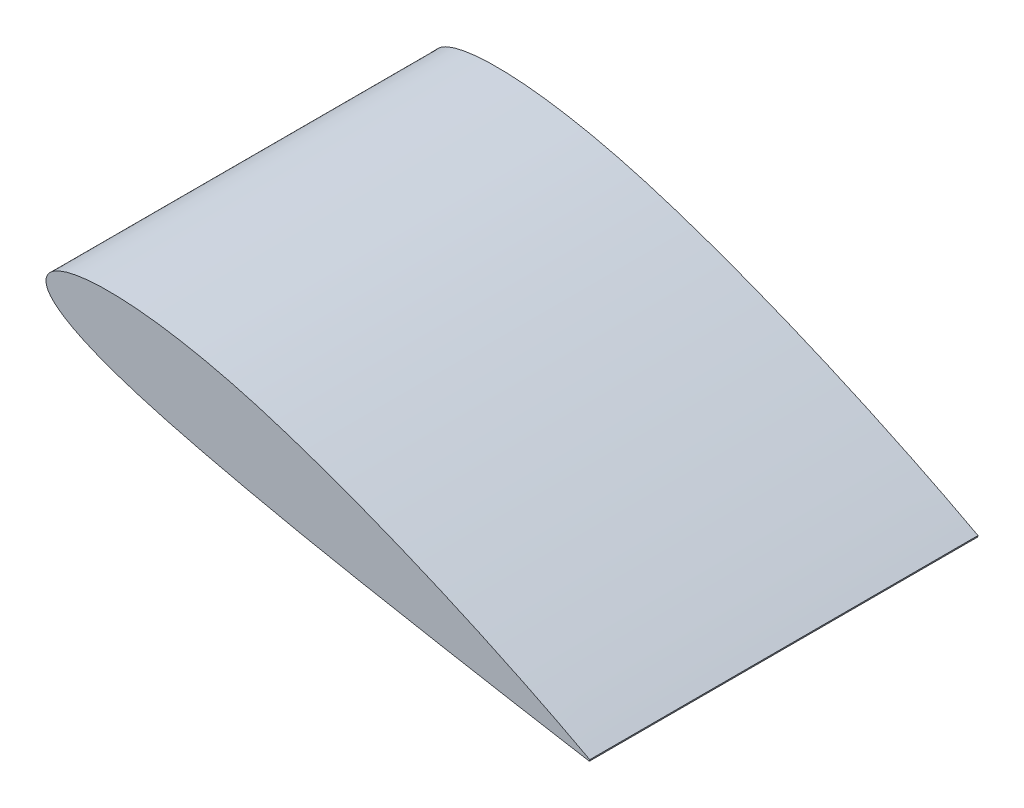
ISO-10303-21;
HEADER;
FILE_DESCRIPTION(('STEP AP214'),'2;1');
FILE_NAME('part.step','',(''),(''),'','','');
FILE_SCHEMA(('AUTOMOTIVE_DESIGN { 1 0 10303 214 1 1 1 1 }'));
ENDSEC;
DATA;
#1=APPLICATION_CONTEXT('core data for automotive mechanical design processes');
#2=APPLICATION_PROTOCOL_DEFINITION('international standard','automotive_design',2000,#1);
#3=PRODUCT_CONTEXT('',#1,'mechanical');
#4=PRODUCT('Part','Part','',(#3));
#5=PRODUCT_RELATED_PRODUCT_CATEGORY('part','',(#4));
#6=PRODUCT_DEFINITION_FORMATION('','',#4);
#7=PRODUCT_DEFINITION_CONTEXT('part definition',#1,'design');
#8=PRODUCT_DEFINITION('design','',#6,#7);
#9=PRODUCT_DEFINITION_SHAPE('','',#8);
#10=(LENGTH_UNIT() NAMED_UNIT(*) SI_UNIT(.MILLI.,.METRE.));
#11=(NAMED_UNIT(*) PLANE_ANGLE_UNIT() SI_UNIT($,.RADIAN.));
#12=(NAMED_UNIT(*) SI_UNIT($,.STERADIAN.) SOLID_ANGLE_UNIT());
#13=UNCERTAINTY_MEASURE_WITH_UNIT(LENGTH_MEASURE(1.E-05),#10,'distance_accuracy_value','');
#14=(GEOMETRIC_REPRESENTATION_CONTEXT(3) GLOBAL_UNCERTAINTY_ASSIGNED_CONTEXT((#13)) GLOBAL_UNIT_ASSIGNED_CONTEXT((#10,
#11,#12)) REPRESENTATION_CONTEXT('',''));
#15=CARTESIAN_POINT('',(0.,0.,0.));
#16=DIRECTION('',(0.,0.,1.));
#17=DIRECTION('',(1.,0.,0.));
#18=AXIS2_PLACEMENT_3D('',#15,#16,#17);
#19=CARTESIAN_POINT('',(699.902915977155,-187.926757207641,500.));
#20=CARTESIAN_POINT('',(699.333794343994,-187.615798784839,500.));
#21=CARTESIAN_POINT('',(697.003057499241,-186.342323641773,500.));
#22=CARTESIAN_POINT('',(691.706465498897,-183.566720524215,500.));
#23=CARTESIAN_POINT('',(682.929518690761,-178.927202269035,500.));
#24=CARTESIAN_POINT('',(670.734635910661,-172.587268294808,500.));
#25=CARTESIAN_POINT('',(655.254514275697,-164.637979221625,500.));
#26=CARTESIAN_POINT('',(628.51923701653,-151.188127115423,500.));
#27=CARTESIAN_POINT('',(588.238285800469,-131.604730884752,500.));
#28=CARTESIAN_POINT('',(532.717659995749,-105.9918947151,500.));
#29=CARTESIAN_POINT('',(480.985396172177,-83.6049617111104,500.));
#30=CARTESIAN_POINT('',(436.271200745496,-65.3508165835526,500.));
#31=CARTESIAN_POINT('',(401.149264546269,-51.6180728873574,500.));
#32=CARTESIAN_POINT('',(365.418441055391,-38.3681084111872,500.));
#33=CARTESIAN_POINT('',(329.460475280361,-25.7882910033477,500.));
#34=CARTESIAN_POINT('',(293.552968993975,-14.05249294356,500.));
#35=CARTESIAN_POINT('',(258.025883019635,-3.55066883619914,500.));
#36=CARTESIAN_POINT('',(223.256407785801,5.43753248814113,500.));
#37=CARTESIAN_POINT('',(189.768196489828,12.7935484295022,500.));
#38=CARTESIAN_POINT('',(157.957614771441,18.4363564134927,500.));
#39=CARTESIAN_POINT('',(128.211696152898,22.3635813012742,500.));
#40=CARTESIAN_POINT('',(100.886653180819,24.5534931399405,500.));
#41=CARTESIAN_POINT('',(76.3193689961319,25.1099895590709,500.));
#42=CARTESIAN_POINT('',(54.8020067588682,24.1004728455233,500.));
#43=CARTESIAN_POINT('',(36.5732126995239,21.6738742830355,500.));
#44=CARTESIAN_POINT('',(21.7891237429012,17.9428472797509,500.));
#45=CARTESIAN_POINT('',(10.5314709430366,12.9956718416433,500.));
#46=CARTESIAN_POINT('',(2.71012393249206,6.71116474572603,500.));
#47=CARTESIAN_POINT('',(-1.05404577080004,-1.28850777460424,500.));
#48=CARTESIAN_POINT('',(-0.0411436154458281,-10.0547716300213,500.));
#49=CARTESIAN_POINT('',(5.27363422796768,-18.5019472531819,500.));
#50=CARTESIAN_POINT('',(14.1664009090334,-26.8185975559487,500.));
#51=CARTESIAN_POINT('',(26.5991587934725,-35.2436916261235,500.));
#52=CARTESIAN_POINT('',(42.5030034244498,-43.7396667508398,500.));
#53=CARTESIAN_POINT('',(61.7352293342016,-52.24818608363,500.));
#54=CARTESIAN_POINT('',(84.0855758224502,-60.7228727461613,500.));
#55=CARTESIAN_POINT('',(109.321844712911,-69.1001199287331,500.));
#56=CARTESIAN_POINT('',(137.166605657293,-77.3557351475177,500.));
#57=CARTESIAN_POINT('',(167.316492874106,-85.4956608256443,500.));
#58=CARTESIAN_POINT('',(199.448997481871,-93.5080224639628,500.));
#59=CARTESIAN_POINT('',(233.212008302088,-101.433824974304,500.));
#60=CARTESIAN_POINT('',(268.342246073246,-109.334179404314,500.));
#61=CARTESIAN_POINT('',(304.472681481,-117.17291109456,500.));
#62=CARTESIAN_POINT('',(341.252306909443,-124.725547977128,500.));
#63=CARTESIAN_POINT('',(378.150259820163,-132.008668482711,500.));
#64=CARTESIAN_POINT('',(426.343219840961,-141.275278260427,500.));
#65=CARTESIAN_POINT('',(483.808360161579,-151.937469492319,500.));
#66=CARTESIAN_POINT('',(538.779300070836,-161.918440967627,500.));
#67=CARTESIAN_POINT('',(586.903551236403,-170.503937686413,500.));
#68=CARTESIAN_POINT('',(620.2772830802,-176.40528966579,500.));
#69=CARTESIAN_POINT('',(649.654019661737,-181.496335843397,500.));
#70=CARTESIAN_POINT('',(666.762364969982,-184.450528708374,500.));
#71=CARTESIAN_POINT('',(680.287724080427,-186.753782534746,500.));
#72=CARTESIAN_POINT('',(690.062017240682,-188.419767077199,500.));
#73=CARTESIAN_POINT('',(696.003010612765,-189.402300451271,500.));
#74=CARTESIAN_POINT('',(698.665758079207,-189.86531114147,500.));
#75=CARTESIAN_POINT('',(699.351530356892,-189.984556357027,500.));
#76=B_SPLINE_CURVE_WITH_KNOTS('',3,(#19,#20,#21,#22,#23,#24,#25,#26,#27,#28,#29,#30,#31,#32,#33,
#34,#35,#36,#37,#38,#39,#40,#41,#42,#43,#44,#45,#46,#47,#48,#49,#50,#51,#52,#53,#54,#55,#56,#57,
#58,#59,#60,#61,#62,#63,#64,#65,#66,#67,#68,#69,#70,#71,#72,#73,#74,#75),.UNSPECIFIED.,.F.,.F.,
(4,1,1,1,1,1,1,1,1,1,1,1,1,1,1,1,1,1,1,1,1,1,1,1,1,1,1,1,1,1,1,1,1,1,1,1,1,1,1,1,1,1,1,1,1,1,1,
1,1,1,1,1,1,1,4),(0.,0.00130837081542839,0.00535820093360155,0.0120634085253878,
0.0213373007121304,0.0330866187411575,0.0471706431167192,0.0817143521603722,0.123442225424641,
0.170516869891991,0.195424313078073,0.220875125128334,0.246594093158621,0.27230183119837,
0.297725323194622,0.322799376279139,0.347028843152348,0.370161526826169,0.391953614266856,
0.412187725503294,0.430670139078719,0.447230521373444,0.461731544762895,0.474085211958424,
0.484275746782023,0.492391838666874,0.498749378071359,0.504100298021388,0.509453028247956,
0.515789796667128,0.523837665507612,0.533884867180463,0.546005346930758,0.560170801963068,
0.576284399119538,0.59421119075826,0.613803378609794,0.63486930365632,0.657209967038878,
0.680611018884909,0.704834651870993,0.729852897081449,0.755196950720251,0.780582678334603,
0.80572855379656,0.854204496729438,0.898493682913272,0.918442716247676,0.952825660165467,
0.966867903961449,0.97859219917356,0.987851654270917,0.994547443989921,0.998595731738975,1.),.UNSPECIFIED.);
#77=DIRECTION('',(0.,0.,-1.));
#78=VECTOR('',#77,1.);
#79=SURFACE_OF_LINEAR_EXTRUSION('',#76,#78);
#80=CARTESIAN_POINT('',(699.902915977155,-187.926757207641,0.));
#81=CARTESIAN_POINT('',(699.333794343994,-187.615798784839,0.));
#82=CARTESIAN_POINT('',(697.003057499241,-186.342323641773,0.));
#83=CARTESIAN_POINT('',(691.706465498897,-183.566720524215,0.));
#84=CARTESIAN_POINT('',(682.929518690761,-178.927202269035,0.));
#85=CARTESIAN_POINT('',(670.734635910661,-172.587268294808,0.));
#86=CARTESIAN_POINT('',(655.254514275697,-164.637979221625,0.));
#87=CARTESIAN_POINT('',(628.51923701653,-151.188127115423,0.));
#88=CARTESIAN_POINT('',(588.238285800469,-131.604730884752,0.));
#89=CARTESIAN_POINT('',(532.717659995749,-105.9918947151,0.));
#90=CARTESIAN_POINT('',(480.985396172177,-83.6049617111104,0.));
#91=CARTESIAN_POINT('',(436.271200745496,-65.3508165835526,0.));
#92=CARTESIAN_POINT('',(401.149264546269,-51.6180728873574,0.));
#93=CARTESIAN_POINT('',(365.418441055391,-38.3681084111872,0.));
#94=CARTESIAN_POINT('',(329.460475280361,-25.7882910033477,0.));
#95=CARTESIAN_POINT('',(293.552968993975,-14.05249294356,0.));
#96=CARTESIAN_POINT('',(258.025883019635,-3.55066883619914,0.));
#97=CARTESIAN_POINT('',(223.256407785801,5.43753248814113,0.));
#98=CARTESIAN_POINT('',(189.768196489828,12.7935484295022,0.));
#99=CARTESIAN_POINT('',(157.957614771441,18.4363564134927,0.));
#100=CARTESIAN_POINT('',(128.211696152898,22.3635813012742,0.));
#101=CARTESIAN_POINT('',(100.886653180819,24.5534931399405,0.));
#102=CARTESIAN_POINT('',(76.3193689961319,25.1099895590709,0.));
#103=CARTESIAN_POINT('',(54.8020067588682,24.1004728455233,0.));
#104=CARTESIAN_POINT('',(36.5732126995239,21.6738742830355,0.));
#105=CARTESIAN_POINT('',(21.7891237429012,17.9428472797509,0.));
#106=CARTESIAN_POINT('',(10.5314709430366,12.9956718416433,0.));
#107=CARTESIAN_POINT('',(2.71012393249206,6.71116474572603,0.));
#108=CARTESIAN_POINT('',(-1.05404577080004,-1.28850777460424,0.));
#109=CARTESIAN_POINT('',(-0.0411436154458281,-10.0547716300213,0.));
#110=CARTESIAN_POINT('',(5.27363422796768,-18.5019472531819,0.));
#111=CARTESIAN_POINT('',(14.1664009090334,-26.8185975559487,0.));
#112=CARTESIAN_POINT('',(26.5991587934725,-35.2436916261235,0.));
#113=CARTESIAN_POINT('',(42.5030034244498,-43.7396667508398,0.));
#114=CARTESIAN_POINT('',(61.7352293342016,-52.24818608363,0.));
#115=CARTESIAN_POINT('',(84.0855758224502,-60.7228727461613,0.));
#116=CARTESIAN_POINT('',(109.321844712911,-69.1001199287331,0.));
#117=CARTESIAN_POINT('',(137.166605657293,-77.3557351475177,0.));
#118=CARTESIAN_POINT('',(167.316492874106,-85.4956608256443,0.));
#119=CARTESIAN_POINT('',(199.448997481871,-93.5080224639628,0.));
#120=CARTESIAN_POINT('',(233.212008302088,-101.433824974304,0.));
#121=CARTESIAN_POINT('',(268.342246073246,-109.334179404314,0.));
#122=CARTESIAN_POINT('',(304.472681481,-117.17291109456,0.));
#123=CARTESIAN_POINT('',(341.252306909443,-124.725547977128,0.));
#124=CARTESIAN_POINT('',(378.150259820163,-132.008668482711,0.));
#125=CARTESIAN_POINT('',(426.343219840961,-141.275278260427,0.));
#126=CARTESIAN_POINT('',(483.808360161579,-151.937469492319,0.));
#127=CARTESIAN_POINT('',(538.779300070836,-161.918440967627,0.));
#128=CARTESIAN_POINT('',(586.903551236403,-170.503937686413,0.));
#129=CARTESIAN_POINT('',(620.2772830802,-176.40528966579,0.));
#130=CARTESIAN_POINT('',(649.654019661737,-181.496335843397,0.));
#131=CARTESIAN_POINT('',(666.762364969982,-184.450528708374,0.));
#132=CARTESIAN_POINT('',(680.287724080427,-186.753782534746,0.));
#133=CARTESIAN_POINT('',(690.062017240682,-188.419767077199,0.));
#134=CARTESIAN_POINT('',(696.003010612765,-189.402300451271,0.));
#135=CARTESIAN_POINT('',(698.665758079207,-189.86531114147,0.));
#136=CARTESIAN_POINT('',(699.351530356892,-189.984556357027,0.));
#137=B_SPLINE_CURVE_WITH_KNOTS('',3,(#80,#81,#82,#83,#84,#85,#86,#87,#88,#89,#90,#91,#92,#93,
#94,#95,#96,#97,#98,#99,#100,#101,#102,#103,#104,#105,#106,#107,#108,#109,#110,#111,#112,#113,
#114,#115,#116,#117,#118,#119,#120,#121,#122,#123,#124,#125,#126,#127,#128,#129,#130,#131,#132,
#133,#134,#135,#136),.UNSPECIFIED.,.F.,.F.,(4,1,1,1,1,1,1,1,1,1,1,1,1,1,1,1,1,1,1,1,1,1,1,1,1,1,
1,1,1,1,1,1,1,1,1,1,1,1,1,1,1,1,1,1,1,1,1,1,1,1,1,1,1,1,4),(0.,0.00130837081542839,
0.00535820093360155,0.0120634085253878,0.0213373007121304,0.0330866187411575,0.0471706431167192,
0.0817143521603722,0.123442225424641,0.170516869891991,0.195424313078073,0.220875125128334,
0.246594093158621,0.27230183119837,0.297725323194622,0.322799376279139,0.347028843152348,
0.370161526826169,0.391953614266856,0.412187725503294,0.430670139078719,0.447230521373444,
0.461731544762895,0.474085211958424,0.484275746782023,0.492391838666874,0.498749378071359,
0.504100298021388,0.509453028247956,0.515789796667128,0.523837665507612,0.533884867180463,
0.546005346930758,0.560170801963068,0.576284399119538,0.59421119075826,0.613803378609794,
0.63486930365632,0.657209967038878,0.680611018884909,0.704834651870993,0.729852897081449,
0.755196950720251,0.780582678334603,0.80572855379656,0.854204496729438,0.898493682913272,
0.918442716247676,0.952825660165467,0.966867903961449,0.97859219917356,0.987851654270917,
0.994547443989921,0.998595731738975,1.),.UNSPECIFIED.);
#138=CARTESIAN_POINT('',(699.902915977155,-187.926757207641,0.));
#139=VERTEX_POINT('',#138);
#140=CARTESIAN_POINT('',(699.351530356892,-189.984556357027,0.));
#141=VERTEX_POINT('',#140);
#142=EDGE_CURVE('E77',#139,#141,#137,.T.);
#143=ORIENTED_EDGE('',*,*,#142,.T.);
#144=DIRECTION('',(0.,0.,-1.));
#145=VECTOR('',#144,1.);
#146=CARTESIAN_POINT('',(699.351530356892,-189.984556357027,500.));
#147=LINE('',#146,#145);
#148=CARTESIAN_POINT('',(699.351530356892,-189.984556357027,500.));
#149=VERTEX_POINT('',#148);
#150=EDGE_CURVE('E11',#149,#141,#147,.T.);
#151=ORIENTED_EDGE('',*,*,#150,.F.);
#152=CARTESIAN_POINT('',(699.902915977155,-187.926757207641,500.));
#153=VERTEX_POINT('',#152);
#154=EDGE_CURVE('E76',#153,#149,#76,.T.);
#155=ORIENTED_EDGE('',*,*,#154,.F.);
#156=DIRECTION('',(0.,0.,-1.));
#157=VECTOR('',#156,1.);
#158=CARTESIAN_POINT('',(699.902915977155,-187.926757207641,500.));
#159=LINE('',#158,#157);
#160=EDGE_CURVE('E53',#153,#139,#159,.T.);
#161=ORIENTED_EDGE('',*,*,#160,.T.);
#162=EDGE_LOOP('',(#143,#151,#155,#161));
#163=FACE_BOUND('',#162,.T.);
#164=ADVANCED_FACE('F43',(#163),#79,.F.);
#165=CARTESIAN_POINT('',(699.902915977155,-187.926757207641,500.));
#166=DIRECTION('',(-0.965925826289057,0.258819045102563,0.));
#167=DIRECTION('',(-0.258819045102563,-0.965925826289057,0.));
#168=AXIS2_PLACEMENT_3D('',#165,#166,#167);
#169=PLANE('',#168);
#170=DIRECTION('',(0.258819045102563,0.965925826289057,0.));
#171=VECTOR('',#170,1.);
#172=CARTESIAN_POINT('',(699.902915977155,-187.926757207641,0.));
#173=LINE('',#172,#171);
#174=EDGE_CURVE('E68',#141,#139,#173,.T.);
#175=ORIENTED_EDGE('',*,*,#174,.T.);
#176=ORIENTED_EDGE('',*,*,#160,.F.);
#177=DIRECTION('',(0.258819045102563,0.965925826289057,0.));
#178=VECTOR('',#177,1.);
#179=CARTESIAN_POINT('',(699.902915977155,-187.926757207641,500.));
#180=LINE('',#179,#178);
#181=EDGE_CURVE('E60',#149,#153,#180,.T.);
#182=ORIENTED_EDGE('',*,*,#181,.F.);
#183=ORIENTED_EDGE('',*,*,#150,.T.);
#184=EDGE_LOOP('',(#175,#176,#182,#183));
#185=FACE_BOUND('',#184,.T.);
#186=ADVANCED_FACE('F71',(#185),#169,.F.);
#187=CARTESIAN_POINT('',(1.86118159511987,4.31133340308543,500.));
#188=DIRECTION('',(0.,0.,-1.));
#189=DIRECTION('',(-1.,0.,0.));
#190=AXIS2_PLACEMENT_3D('',#187,#188,#189);
#191=PLANE('',#190);
#192=ORIENTED_EDGE('',*,*,#154,.T.);
#193=ORIENTED_EDGE('',*,*,#181,.T.);
#194=EDGE_LOOP('',(#192,#193));
#195=FACE_BOUND('',#194,.T.);
#196=ADVANCED_FACE('F99',(#195),#191,.F.);
#197=CARTESIAN_POINT('',(1.86118159511987,4.31133340308543,0.));
#198=DIRECTION('',(0.,0.,-1.));
#199=DIRECTION('',(-1.,0.,0.));
#200=AXIS2_PLACEMENT_3D('',#197,#198,#199);
#201=PLANE('',#200);
#202=ORIENTED_EDGE('',*,*,#142,.F.);
#203=ORIENTED_EDGE('',*,*,#174,.F.);
#204=EDGE_LOOP('',(#202,#203));
#205=FACE_BOUND('',#204,.T.);
#206=ADVANCED_FACE('F81',(#205),#201,.T.);
#207=CLOSED_SHELL('',(#164,#186,#196,#206));
#208=MANIFOLD_SOLID_BREP('B2',#207);
#209=ADVANCED_BREP_SHAPE_REPRESENTATION('',(#18,#208),#14);
#210=SHAPE_DEFINITION_REPRESENTATION(#9,#209);
ENDSEC;
END-ISO-10303-21;
